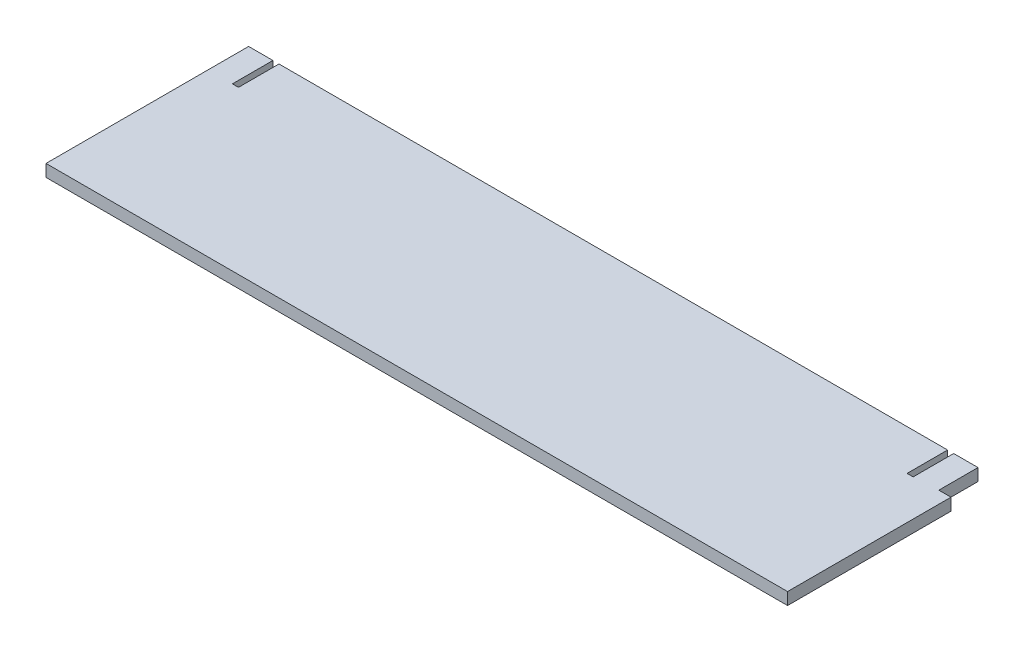
ISO-10303-21;
HEADER;
FILE_DESCRIPTION(('STEP AP214'),'2;1');
FILE_NAME('part.step','',(''),(''),'','','');
FILE_SCHEMA(('AUTOMOTIVE_DESIGN { 1 0 10303 214 1 1 1 1 }'));
ENDSEC;
DATA;
#1=APPLICATION_CONTEXT('core data for automotive mechanical design processes');
#2=APPLICATION_PROTOCOL_DEFINITION('international standard','automotive_design',2000,#1);
#3=PRODUCT_CONTEXT('',#1,'mechanical');
#4=PRODUCT('Part','Part','',(#3));
#5=PRODUCT_RELATED_PRODUCT_CATEGORY('part','',(#4));
#6=PRODUCT_DEFINITION_FORMATION('','',#4);
#7=PRODUCT_DEFINITION_CONTEXT('part definition',#1,'design');
#8=PRODUCT_DEFINITION('design','',#6,#7);
#9=PRODUCT_DEFINITION_SHAPE('','',#8);
#10=(LENGTH_UNIT() NAMED_UNIT(*) SI_UNIT(.MILLI.,.METRE.));
#11=(NAMED_UNIT(*) PLANE_ANGLE_UNIT() SI_UNIT($,.RADIAN.));
#12=(NAMED_UNIT(*) SI_UNIT($,.STERADIAN.) SOLID_ANGLE_UNIT());
#13=UNCERTAINTY_MEASURE_WITH_UNIT(LENGTH_MEASURE(1.E-05),#10,'distance_accuracy_value','');
#14=(GEOMETRIC_REPRESENTATION_CONTEXT(3) GLOBAL_UNCERTAINTY_ASSIGNED_CONTEXT((#13)) GLOBAL_UNIT_ASSIGNED_CONTEXT((#10,
#11,#12)) REPRESENTATION_CONTEXT('',''));
#15=CARTESIAN_POINT('',(0.,0.,0.));
#16=DIRECTION('',(0.,0.,1.));
#17=DIRECTION('',(1.,0.,0.));
#18=AXIS2_PLACEMENT_3D('',#15,#16,#17);
#19=CARTESIAN_POINT('',(-90.,1.5,25.));
#20=DIRECTION('',(1.,0.,0.));
#21=DIRECTION('',(0.,0.,-1.));
#22=AXIS2_PLACEMENT_3D('',#19,#20,#21);
#23=PLANE('',#22);
#24=DIRECTION('',(0.,0.,1.));
#25=VECTOR('',#24,1.);
#26=CARTESIAN_POINT('',(-90.,-1.5,25.));
#27=LINE('',#26,#25);
#28=CARTESIAN_POINT('',(-90.,-1.5,-25.));
#29=VERTEX_POINT('',#28);
#30=CARTESIAN_POINT('',(-90.,-1.5,25.));
#31=VERTEX_POINT('',#30);
#32=EDGE_CURVE('E162',#29,#31,#27,.T.);
#33=ORIENTED_EDGE('',*,*,#32,.T.);
#34=DIRECTION('',(0.,-1.,0.));
#35=VECTOR('',#34,1.);
#36=CARTESIAN_POINT('',(-90.,1.5,25.));
#37=LINE('',#36,#35);
#38=CARTESIAN_POINT('',(-90.,1.5,25.));
#39=VERTEX_POINT('',#38);
#40=EDGE_CURVE('E11',#39,#31,#37,.T.);
#41=ORIENTED_EDGE('',*,*,#40,.F.);
#42=DIRECTION('',(0.,0.,1.));
#43=VECTOR('',#42,1.);
#44=CARTESIAN_POINT('',(-90.,1.5,25.));
#45=LINE('',#44,#43);
#46=CARTESIAN_POINT('',(-90.,1.5,-25.));
#47=VERTEX_POINT('',#46);
#48=EDGE_CURVE('E187',#47,#39,#45,.T.);
#49=ORIENTED_EDGE('',*,*,#48,.F.);
#50=DIRECTION('',(0.,-1.,0.));
#51=VECTOR('',#50,1.);
#52=CARTESIAN_POINT('',(-90.,1.5,-25.));
#53=LINE('',#52,#51);
#54=EDGE_CURVE('E158',#47,#29,#53,.T.);
#55=ORIENTED_EDGE('',*,*,#54,.T.);
#56=EDGE_LOOP('',(#33,#41,#49,#55));
#57=FACE_BOUND('',#56,.T.);
#58=ADVANCED_FACE('F35',(#57),#23,.F.);
#59=CARTESIAN_POINT('',(-90.,1.5,25.));
#60=DIRECTION('',(0.,0.,-1.));
#61=DIRECTION('',(-1.,0.,0.));
#62=AXIS2_PLACEMENT_3D('',#59,#60,#61);
#63=PLANE('',#62);
#64=DIRECTION('',(1.,0.,0.));
#65=VECTOR('',#64,1.);
#66=CARTESIAN_POINT('',(-90.,-1.5,25.));
#67=LINE('',#66,#65);
#68=CARTESIAN_POINT('',(93.,-1.5,25.));
#69=VERTEX_POINT('',#68);
#70=EDGE_CURVE('E165',#31,#69,#67,.T.);
#71=ORIENTED_EDGE('',*,*,#70,.T.);
#72=DIRECTION('',(0.,-1.,0.));
#73=VECTOR('',#72,1.);
#74=CARTESIAN_POINT('',(93.,1.5,25.));
#75=LINE('',#74,#73);
#76=CARTESIAN_POINT('',(93.,1.5,25.));
#77=VERTEX_POINT('',#76);
#78=EDGE_CURVE('E166',#77,#69,#75,.T.);
#79=ORIENTED_EDGE('',*,*,#78,.F.);
#80=DIRECTION('',(1.,0.,0.));
#81=VECTOR('',#80,1.);
#82=CARTESIAN_POINT('',(-90.,1.5,25.));
#83=LINE('',#82,#81);
#84=EDGE_CURVE('E108',#39,#77,#83,.T.);
#85=ORIENTED_EDGE('',*,*,#84,.F.);
#86=ORIENTED_EDGE('',*,*,#40,.T.);
#87=EDGE_LOOP('',(#71,#79,#85,#86));
#88=FACE_BOUND('',#87,.T.);
#89=ADVANCED_FACE('F279',(#88),#63,.F.);
#90=CARTESIAN_POINT('',(90.,1.5,25.));
#91=DIRECTION('',(-1.,0.,0.));
#92=DIRECTION('',(0.,0.,1.));
#93=AXIS2_PLACEMENT_3D('',#90,#91,#92);
#94=PLANE('',#93);
#95=DIRECTION('',(0.,0.,-1.));
#96=VECTOR('',#95,1.);
#97=CARTESIAN_POINT('',(90.,1.5,25.));
#98=LINE('',#97,#96);
#99=CARTESIAN_POINT('',(90.,1.5,-15.3314062519563));
#100=VERTEX_POINT('',#99);
#101=CARTESIAN_POINT('',(90.,1.5,-25.));
#102=VERTEX_POINT('',#101);
#103=EDGE_CURVE('E254',#100,#102,#98,.T.);
#104=ORIENTED_EDGE('',*,*,#103,.F.);
#105=DIRECTION('',(0.,-1.,0.));
#106=VECTOR('',#105,1.);
#107=CARTESIAN_POINT('',(90.,1.5,-15.3314062519563));
#108=LINE('',#107,#106);
#109=CARTESIAN_POINT('',(90.,-1.5,-15.3314062519563));
#110=VERTEX_POINT('',#109);
#111=EDGE_CURVE('E264',#100,#110,#108,.T.);
#112=ORIENTED_EDGE('',*,*,#111,.T.);
#113=DIRECTION('',(0.,0.,-1.));
#114=VECTOR('',#113,1.);
#115=CARTESIAN_POINT('',(90.,-1.5,25.));
#116=LINE('',#115,#114);
#117=CARTESIAN_POINT('',(90.,-1.5,-25.));
#118=VERTEX_POINT('',#117);
#119=EDGE_CURVE('E169',#110,#118,#116,.T.);
#120=ORIENTED_EDGE('',*,*,#119,.T.);
#121=DIRECTION('',(0.,-1.,0.));
#122=VECTOR('',#121,1.);
#123=CARTESIAN_POINT('',(90.,1.5,-25.));
#124=LINE('',#123,#122);
#125=EDGE_CURVE('E42',#102,#118,#124,.T.);
#126=ORIENTED_EDGE('',*,*,#125,.F.);
#127=EDGE_LOOP('',(#104,#112,#120,#126));
#128=FACE_BOUND('',#127,.T.);
#129=ADVANCED_FACE('F263',(#128),#94,.F.);
#130=CARTESIAN_POINT('',(84.,1.5,-25.));
#131=DIRECTION('',(0.,0.,1.));
#132=DIRECTION('',(1.,0.,0.));
#133=AXIS2_PLACEMENT_3D('',#130,#131,#132);
#134=PLANE('',#133);
#135=DIRECTION('',(-1.,0.,0.));
#136=VECTOR('',#135,1.);
#137=CARTESIAN_POINT('',(84.,-1.5,-25.));
#138=LINE('',#137,#136);
#139=CARTESIAN_POINT('',(84.,-1.5,-25.));
#140=VERTEX_POINT('',#139);
#141=EDGE_CURVE('E171',#118,#140,#138,.T.);
#142=ORIENTED_EDGE('',*,*,#141,.T.);
#143=DIRECTION('',(0.,-1.,0.));
#144=VECTOR('',#143,1.);
#145=CARTESIAN_POINT('',(84.,1.5,-25.));
#146=LINE('',#145,#144);
#147=CARTESIAN_POINT('',(84.,1.5,-25.));
#148=VERTEX_POINT('',#147);
#149=EDGE_CURVE('E203',#148,#140,#146,.T.);
#150=ORIENTED_EDGE('',*,*,#149,.F.);
#151=DIRECTION('',(-1.,0.,0.));
#152=VECTOR('',#151,1.);
#153=CARTESIAN_POINT('',(84.,1.5,-25.));
#154=LINE('',#153,#152);
#155=EDGE_CURVE('E212',#102,#148,#154,.T.);
#156=ORIENTED_EDGE('',*,*,#155,.F.);
#157=ORIENTED_EDGE('',*,*,#125,.T.);
#158=EDGE_LOOP('',(#142,#150,#156,#157));
#159=FACE_BOUND('',#158,.T.);
#160=ADVANCED_FACE('F210',(#159),#134,.F.);
#161=CARTESIAN_POINT('',(84.,1.5,-15.));
#162=DIRECTION('',(1.,0.,0.));
#163=DIRECTION('',(0.,0.,-1.));
#164=AXIS2_PLACEMENT_3D('',#161,#162,#163);
#165=PLANE('',#164);
#166=DIRECTION('',(0.,0.,1.));
#167=VECTOR('',#166,1.);
#168=CARTESIAN_POINT('',(84.,-1.5,-15.));
#169=LINE('',#168,#167);
#170=CARTESIAN_POINT('',(84.,-1.5,-15.));
#171=VERTEX_POINT('',#170);
#172=EDGE_CURVE('E173',#140,#171,#169,.T.);
#173=ORIENTED_EDGE('',*,*,#172,.T.);
#174=DIRECTION('',(0.,-1.,0.));
#175=VECTOR('',#174,1.);
#176=CARTESIAN_POINT('',(84.,1.5,-15.));
#177=LINE('',#176,#175);
#178=CARTESIAN_POINT('',(84.,1.5,-15.));
#179=VERTEX_POINT('',#178);
#180=EDGE_CURVE('E200',#179,#171,#177,.T.);
#181=ORIENTED_EDGE('',*,*,#180,.F.);
#182=DIRECTION('',(0.,0.,1.));
#183=VECTOR('',#182,1.);
#184=CARTESIAN_POINT('',(84.,1.5,-15.));
#185=LINE('',#184,#183);
#186=EDGE_CURVE('E233',#148,#179,#185,.T.);
#187=ORIENTED_EDGE('',*,*,#186,.F.);
#188=ORIENTED_EDGE('',*,*,#149,.T.);
#189=EDGE_LOOP('',(#173,#181,#187,#188));
#190=FACE_BOUND('',#189,.T.);
#191=ADVANCED_FACE('F224',(#190),#165,.F.);
#192=CARTESIAN_POINT('',(82.5,1.5,-15.));
#193=DIRECTION('',(0.,0.,1.));
#194=DIRECTION('',(1.,0.,0.));
#195=AXIS2_PLACEMENT_3D('',#192,#193,#194);
#196=PLANE('',#195);
#197=DIRECTION('',(-1.,0.,0.));
#198=VECTOR('',#197,1.);
#199=CARTESIAN_POINT('',(82.5,-1.5,-15.));
#200=LINE('',#199,#198);
#201=CARTESIAN_POINT('',(82.5,-1.5,-15.));
#202=VERTEX_POINT('',#201);
#203=EDGE_CURVE('E175',#171,#202,#200,.T.);
#204=ORIENTED_EDGE('',*,*,#203,.T.);
#205=DIRECTION('',(0.,-1.,0.));
#206=VECTOR('',#205,1.);
#207=CARTESIAN_POINT('',(82.5,1.5,-15.));
#208=LINE('',#207,#206);
#209=CARTESIAN_POINT('',(82.5,1.5,-15.));
#210=VERTEX_POINT('',#209);
#211=EDGE_CURVE('E197',#210,#202,#208,.T.);
#212=ORIENTED_EDGE('',*,*,#211,.F.);
#213=DIRECTION('',(-1.,0.,0.));
#214=VECTOR('',#213,1.);
#215=CARTESIAN_POINT('',(82.5,1.5,-15.));
#216=LINE('',#215,#214);
#217=EDGE_CURVE('E230',#179,#210,#216,.T.);
#218=ORIENTED_EDGE('',*,*,#217,.F.);
#219=ORIENTED_EDGE('',*,*,#180,.T.);
#220=EDGE_LOOP('',(#204,#212,#218,#219));
#221=FACE_BOUND('',#220,.T.);
#222=ADVANCED_FACE('F228',(#221),#196,.F.);
#223=CARTESIAN_POINT('',(82.5,1.5,-25.));
#224=DIRECTION('',(-1.,0.,0.));
#225=DIRECTION('',(0.,0.,1.));
#226=AXIS2_PLACEMENT_3D('',#223,#224,#225);
#227=PLANE('',#226);
#228=DIRECTION('',(0.,0.,-1.));
#229=VECTOR('',#228,1.);
#230=CARTESIAN_POINT('',(82.5,-1.5,-25.));
#231=LINE('',#230,#229);
#232=CARTESIAN_POINT('',(82.5,-1.5,-25.));
#233=VERTEX_POINT('',#232);
#234=EDGE_CURVE('E177',#202,#233,#231,.T.);
#235=ORIENTED_EDGE('',*,*,#234,.T.);
#236=DIRECTION('',(0.,-1.,0.));
#237=VECTOR('',#236,1.);
#238=CARTESIAN_POINT('',(82.5,1.5,-25.));
#239=LINE('',#238,#237);
#240=CARTESIAN_POINT('',(82.5,1.5,-25.));
#241=VERTEX_POINT('',#240);
#242=EDGE_CURVE('E194',#241,#233,#239,.T.);
#243=ORIENTED_EDGE('',*,*,#242,.F.);
#244=DIRECTION('',(0.,0.,-1.));
#245=VECTOR('',#244,1.);
#246=CARTESIAN_POINT('',(82.5,1.5,-25.));
#247=LINE('',#246,#245);
#248=EDGE_CURVE('E232',#210,#241,#247,.T.);
#249=ORIENTED_EDGE('',*,*,#248,.F.);
#250=ORIENTED_EDGE('',*,*,#211,.T.);
#251=EDGE_LOOP('',(#235,#243,#249,#250));
#252=FACE_BOUND('',#251,.T.);
#253=ADVANCED_FACE('F309',(#252),#227,.F.);
#254=CARTESIAN_POINT('',(-82.5,1.5,-25.));
#255=DIRECTION('',(0.,0.,1.));
#256=DIRECTION('',(1.,0.,0.));
#257=AXIS2_PLACEMENT_3D('',#254,#255,#256);
#258=PLANE('',#257);
#259=DIRECTION('',(-1.,0.,0.));
#260=VECTOR('',#259,1.);
#261=CARTESIAN_POINT('',(-82.5,-1.5,-25.));
#262=LINE('',#261,#260);
#263=CARTESIAN_POINT('',(-82.5,-1.5,-25.));
#264=VERTEX_POINT('',#263);
#265=EDGE_CURVE('E179',#233,#264,#262,.T.);
#266=ORIENTED_EDGE('',*,*,#265,.T.);
#267=DIRECTION('',(0.,-1.,0.));
#268=VECTOR('',#267,1.);
#269=CARTESIAN_POINT('',(-82.5,1.5,-25.));
#270=LINE('',#269,#268);
#271=CARTESIAN_POINT('',(-82.5,1.5,-25.));
#272=VERTEX_POINT('',#271);
#273=EDGE_CURVE('E191',#272,#264,#270,.T.);
#274=ORIENTED_EDGE('',*,*,#273,.F.);
#275=DIRECTION('',(-1.,0.,0.));
#276=VECTOR('',#275,1.);
#277=CARTESIAN_POINT('',(-82.5,1.5,-25.));
#278=LINE('',#277,#276);
#279=EDGE_CURVE('E235',#241,#272,#278,.T.);
#280=ORIENTED_EDGE('',*,*,#279,.F.);
#281=ORIENTED_EDGE('',*,*,#242,.T.);
#282=EDGE_LOOP('',(#266,#274,#280,#281));
#283=FACE_BOUND('',#282,.T.);
#284=ADVANCED_FACE('F244',(#283),#258,.F.);
#285=CARTESIAN_POINT('',(-82.5,1.5,-15.));
#286=DIRECTION('',(1.,0.,0.));
#287=DIRECTION('',(0.,0.,-1.));
#288=AXIS2_PLACEMENT_3D('',#285,#286,#287);
#289=PLANE('',#288);
#290=DIRECTION('',(0.,0.,1.));
#291=VECTOR('',#290,1.);
#292=CARTESIAN_POINT('',(-82.5,-1.5,-15.));
#293=LINE('',#292,#291);
#294=CARTESIAN_POINT('',(-82.5,-1.5,-15.));
#295=VERTEX_POINT('',#294);
#296=EDGE_CURVE('E181',#264,#295,#293,.T.);
#297=ORIENTED_EDGE('',*,*,#296,.T.);
#298=DIRECTION('',(0.,-1.,0.));
#299=VECTOR('',#298,1.);
#300=CARTESIAN_POINT('',(-82.5,1.5,-15.));
#301=LINE('',#300,#299);
#302=CARTESIAN_POINT('',(-82.5,1.5,-15.));
#303=VERTEX_POINT('',#302);
#304=EDGE_CURVE('E153',#303,#295,#301,.T.);
#305=ORIENTED_EDGE('',*,*,#304,.F.);
#306=DIRECTION('',(0.,0.,1.));
#307=VECTOR('',#306,1.);
#308=CARTESIAN_POINT('',(-82.5,1.5,-15.));
#309=LINE('',#308,#307);
#310=EDGE_CURVE('E141',#272,#303,#309,.T.);
#311=ORIENTED_EDGE('',*,*,#310,.F.);
#312=ORIENTED_EDGE('',*,*,#273,.T.);
#313=EDGE_LOOP('',(#297,#305,#311,#312));
#314=FACE_BOUND('',#313,.T.);
#315=ADVANCED_FACE('F248',(#314),#289,.F.);
#316=CARTESIAN_POINT('',(-84.,1.5,-15.));
#317=DIRECTION('',(0.,0.,1.));
#318=DIRECTION('',(1.,0.,0.));
#319=AXIS2_PLACEMENT_3D('',#316,#317,#318);
#320=PLANE('',#319);
#321=DIRECTION('',(-1.,0.,0.));
#322=VECTOR('',#321,1.);
#323=CARTESIAN_POINT('',(-84.,-1.5,-15.));
#324=LINE('',#323,#322);
#325=CARTESIAN_POINT('',(-84.,-1.5,-15.));
#326=VERTEX_POINT('',#325);
#327=EDGE_CURVE('E150',#295,#326,#324,.T.);
#328=ORIENTED_EDGE('',*,*,#327,.T.);
#329=DIRECTION('',(0.,-1.,0.));
#330=VECTOR('',#329,1.);
#331=CARTESIAN_POINT('',(-84.,1.5,-15.));
#332=LINE('',#331,#330);
#333=CARTESIAN_POINT('',(-84.,1.5,-15.));
#334=VERTEX_POINT('',#333);
#335=EDGE_CURVE('E147',#334,#326,#332,.T.);
#336=ORIENTED_EDGE('',*,*,#335,.F.);
#337=DIRECTION('',(-1.,0.,0.));
#338=VECTOR('',#337,1.);
#339=CARTESIAN_POINT('',(-84.,1.5,-15.));
#340=LINE('',#339,#338);
#341=EDGE_CURVE('E134',#303,#334,#340,.T.);
#342=ORIENTED_EDGE('',*,*,#341,.F.);
#343=ORIENTED_EDGE('',*,*,#304,.T.);
#344=EDGE_LOOP('',(#328,#336,#342,#343));
#345=FACE_BOUND('',#344,.T.);
#346=ADVANCED_FACE('F148',(#345),#320,.F.);
#347=CARTESIAN_POINT('',(-84.,1.5,-25.));
#348=DIRECTION('',(-1.,0.,0.));
#349=DIRECTION('',(0.,0.,1.));
#350=AXIS2_PLACEMENT_3D('',#347,#348,#349);
#351=PLANE('',#350);
#352=DIRECTION('',(0.,0.,-1.));
#353=VECTOR('',#352,1.);
#354=CARTESIAN_POINT('',(-84.,-1.5,-25.));
#355=LINE('',#354,#353);
#356=CARTESIAN_POINT('',(-84.,-1.5,-25.));
#357=VERTEX_POINT('',#356);
#358=EDGE_CURVE('E184',#326,#357,#355,.T.);
#359=ORIENTED_EDGE('',*,*,#358,.T.);
#360=DIRECTION('',(0.,-1.,0.));
#361=VECTOR('',#360,1.);
#362=CARTESIAN_POINT('',(-84.,1.5,-25.));
#363=LINE('',#362,#361);
#364=CARTESIAN_POINT('',(-84.,1.5,-25.));
#365=VERTEX_POINT('',#364);
#366=EDGE_CURVE('E154',#365,#357,#363,.T.);
#367=ORIENTED_EDGE('',*,*,#366,.F.);
#368=DIRECTION('',(0.,0.,-1.));
#369=VECTOR('',#368,1.);
#370=CARTESIAN_POINT('',(-84.,1.5,-25.));
#371=LINE('',#370,#369);
#372=EDGE_CURVE('E138',#334,#365,#371,.T.);
#373=ORIENTED_EDGE('',*,*,#372,.F.);
#374=ORIENTED_EDGE('',*,*,#335,.T.);
#375=EDGE_LOOP('',(#359,#367,#373,#374));
#376=FACE_BOUND('',#375,.T.);
#377=ADVANCED_FACE('F156',(#376),#351,.F.);
#378=CARTESIAN_POINT('',(-90.,1.5,-25.));
#379=DIRECTION('',(0.,0.,1.));
#380=DIRECTION('',(1.,0.,0.));
#381=AXIS2_PLACEMENT_3D('',#378,#379,#380);
#382=PLANE('',#381);
#383=DIRECTION('',(-1.,0.,0.));
#384=VECTOR('',#383,1.);
#385=CARTESIAN_POINT('',(-90.,-1.5,-25.));
#386=LINE('',#385,#384);
#387=EDGE_CURVE('E100',#357,#29,#386,.T.);
#388=ORIENTED_EDGE('',*,*,#387,.T.);
#389=ORIENTED_EDGE('',*,*,#54,.F.);
#390=DIRECTION('',(-1.,0.,0.));
#391=VECTOR('',#390,1.);
#392=CARTESIAN_POINT('',(-90.,1.5,-25.));
#393=LINE('',#392,#391);
#394=EDGE_CURVE('E58',#365,#47,#393,.T.);
#395=ORIENTED_EDGE('',*,*,#394,.F.);
#396=ORIENTED_EDGE('',*,*,#366,.T.);
#397=EDGE_LOOP('',(#388,#389,#395,#396));
#398=FACE_BOUND('',#397,.T.);
#399=ADVANCED_FACE('F249',(#398),#382,.F.);
#400=CARTESIAN_POINT('',(0.,1.5,0.));
#401=DIRECTION('',(0.,-1.,0.));
#402=DIRECTION('',(0.,0.,-1.));
#403=AXIS2_PLACEMENT_3D('',#400,#401,#402);
#404=PLANE('',#403);
#405=ORIENTED_EDGE('',*,*,#48,.T.);
#406=ORIENTED_EDGE('',*,*,#84,.T.);
#407=DIRECTION('',(0.,0.,-1.));
#408=VECTOR('',#407,1.);
#409=CARTESIAN_POINT('',(93.,1.5,-15.3314062519563));
#410=LINE('',#409,#408);
#411=CARTESIAN_POINT('',(93.,1.5,-15.3314062519563));
#412=VERTEX_POINT('',#411);
#413=EDGE_CURVE('E278',#77,#412,#410,.T.);
#414=ORIENTED_EDGE('',*,*,#413,.T.);
#415=DIRECTION('',(-1.,0.,0.));
#416=VECTOR('',#415,1.);
#417=CARTESIAN_POINT('',(90.,1.5,-15.3314062519563));
#418=LINE('',#417,#416);
#419=EDGE_CURVE('E262',#412,#100,#418,.T.);
#420=ORIENTED_EDGE('',*,*,#419,.T.);
#421=ORIENTED_EDGE('',*,*,#103,.T.);
#422=ORIENTED_EDGE('',*,*,#155,.T.);
#423=ORIENTED_EDGE('',*,*,#186,.T.);
#424=ORIENTED_EDGE('',*,*,#217,.T.);
#425=ORIENTED_EDGE('',*,*,#248,.T.);
#426=ORIENTED_EDGE('',*,*,#279,.T.);
#427=ORIENTED_EDGE('',*,*,#310,.T.);
#428=ORIENTED_EDGE('',*,*,#341,.T.);
#429=ORIENTED_EDGE('',*,*,#372,.T.);
#430=ORIENTED_EDGE('',*,*,#394,.T.);
#431=EDGE_LOOP('',(#405,#406,#414,#420,#421,#422,#423,#424,#425,#426,#427,#428,#429,#430));
#432=FACE_BOUND('',#431,.T.);
#433=ADVANCED_FACE('F136',(#432),#404,.F.);
#434=CARTESIAN_POINT('',(0.,-1.5,0.));
#435=DIRECTION('',(0.,-1.,0.));
#436=DIRECTION('',(0.,0.,-1.));
#437=AXIS2_PLACEMENT_3D('',#434,#435,#436);
#438=PLANE('',#437);
#439=ORIENTED_EDGE('',*,*,#32,.F.);
#440=ORIENTED_EDGE('',*,*,#387,.F.);
#441=ORIENTED_EDGE('',*,*,#358,.F.);
#442=ORIENTED_EDGE('',*,*,#327,.F.);
#443=ORIENTED_EDGE('',*,*,#296,.F.);
#444=ORIENTED_EDGE('',*,*,#265,.F.);
#445=ORIENTED_EDGE('',*,*,#234,.F.);
#446=ORIENTED_EDGE('',*,*,#203,.F.);
#447=ORIENTED_EDGE('',*,*,#172,.F.);
#448=ORIENTED_EDGE('',*,*,#141,.F.);
#449=ORIENTED_EDGE('',*,*,#119,.F.);
#450=DIRECTION('',(-1.,0.,0.));
#451=VECTOR('',#450,1.);
#452=CARTESIAN_POINT('',(90.,-1.5,-15.3314062519563));
#453=LINE('',#452,#451);
#454=CARTESIAN_POINT('',(93.,-1.5,-15.3314062519563));
#455=VERTEX_POINT('',#454);
#456=EDGE_CURVE('E49',#455,#110,#453,.T.);
#457=ORIENTED_EDGE('',*,*,#456,.F.);
#458=DIRECTION('',(0.,0.,-1.));
#459=VECTOR('',#458,1.);
#460=CARTESIAN_POINT('',(93.,-1.5,-15.3314062519563));
#461=LINE('',#460,#459);
#462=EDGE_CURVE('E276',#69,#455,#461,.T.);
#463=ORIENTED_EDGE('',*,*,#462,.F.);
#464=ORIENTED_EDGE('',*,*,#70,.F.);
#465=EDGE_LOOP('',(#439,#440,#441,#442,#443,#444,#445,#446,#447,#448,#449,#457,#463,#464));
#466=FACE_BOUND('',#465,.T.);
#467=ADVANCED_FACE('F219',(#466),#438,.T.);
#468=CARTESIAN_POINT('',(93.,1.5,-15.3314062519563));
#469=DIRECTION('',(-1.,0.,0.));
#470=DIRECTION('',(0.,0.,1.));
#471=AXIS2_PLACEMENT_3D('',#468,#469,#470);
#472=PLANE('',#471);
#473=ORIENTED_EDGE('',*,*,#462,.T.);
#474=DIRECTION('',(0.,-1.,0.));
#475=VECTOR('',#474,1.);
#476=CARTESIAN_POINT('',(93.,1.5,-15.3314062519563));
#477=LINE('',#476,#475);
#478=EDGE_CURVE('E280',#412,#455,#477,.T.);
#479=ORIENTED_EDGE('',*,*,#478,.F.);
#480=ORIENTED_EDGE('',*,*,#413,.F.);
#481=ORIENTED_EDGE('',*,*,#78,.T.);
#482=EDGE_LOOP('',(#473,#479,#480,#481));
#483=FACE_BOUND('',#482,.T.);
#484=ADVANCED_FACE('F281',(#483),#472,.F.);
#485=CARTESIAN_POINT('',(90.,1.5,-15.3314062519563));
#486=DIRECTION('',(0.,0.,1.));
#487=DIRECTION('',(1.,0.,0.));
#488=AXIS2_PLACEMENT_3D('',#485,#486,#487);
#489=PLANE('',#488);
#490=ORIENTED_EDGE('',*,*,#456,.T.);
#491=ORIENTED_EDGE('',*,*,#111,.F.);
#492=ORIENTED_EDGE('',*,*,#419,.F.);
#493=ORIENTED_EDGE('',*,*,#478,.T.);
#494=EDGE_LOOP('',(#490,#491,#492,#493));
#495=FACE_BOUND('',#494,.T.);
#496=ADVANCED_FACE('F287',(#495),#489,.F.);
#497=CLOSED_SHELL('',(#58,#89,#129,#160,#191,#222,#253,#284,#315,#346,#377,#399,#433,#467,#484,#496));
#498=MANIFOLD_SOLID_BREP('B2',#497);
#499=ADVANCED_BREP_SHAPE_REPRESENTATION('',(#18,#498),#14);
#500=SHAPE_DEFINITION_REPRESENTATION(#9,#499);
ENDSEC;
END-ISO-10303-21;
